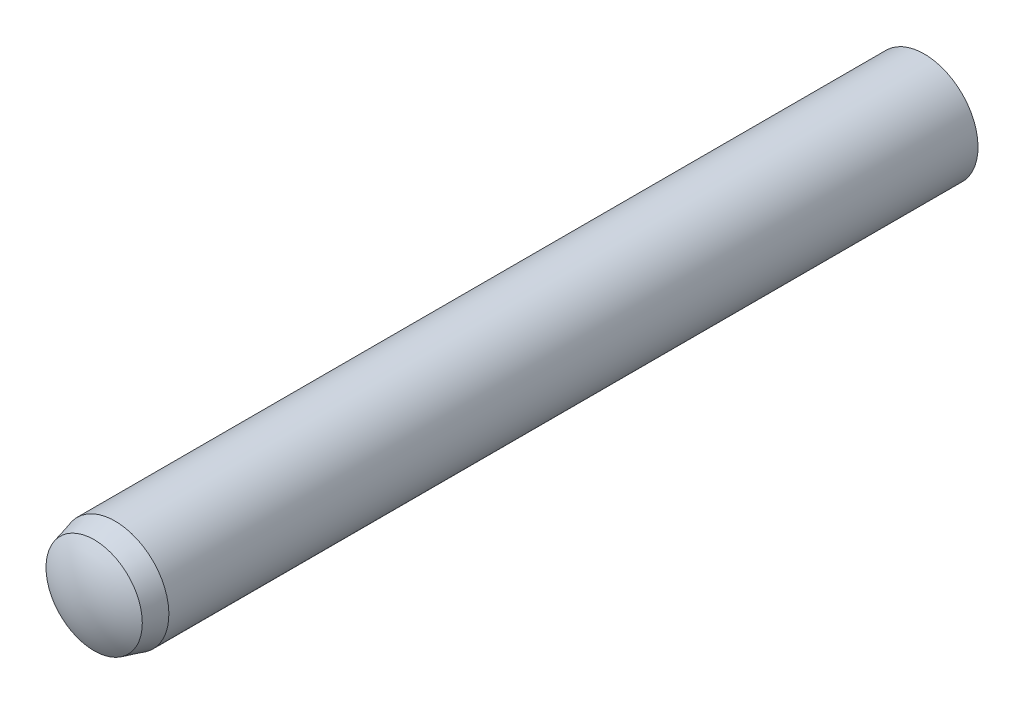
ISO-10303-21;
HEADER;
FILE_DESCRIPTION(('STEP AP214'),'2;1');
FILE_NAME('part.step','',(''),(''),'','','');
FILE_SCHEMA(('AUTOMOTIVE_DESIGN { 1 0 10303 214 1 1 1 1 }'));
ENDSEC;
DATA;
#1=APPLICATION_CONTEXT('core data for automotive mechanical design processes');
#2=APPLICATION_PROTOCOL_DEFINITION('international standard','automotive_design',2000,#1);
#3=PRODUCT_CONTEXT('',#1,'mechanical');
#4=PRODUCT('Part','Part','',(#3));
#5=PRODUCT_RELATED_PRODUCT_CATEGORY('part','',(#4));
#6=PRODUCT_DEFINITION_FORMATION('','',#4);
#7=PRODUCT_DEFINITION_CONTEXT('part definition',#1,'design');
#8=PRODUCT_DEFINITION('design','',#6,#7);
#9=PRODUCT_DEFINITION_SHAPE('','',#8);
#10=(LENGTH_UNIT() NAMED_UNIT(*) SI_UNIT(.MILLI.,.METRE.));
#11=(NAMED_UNIT(*) PLANE_ANGLE_UNIT() SI_UNIT($,.RADIAN.));
#12=(NAMED_UNIT(*) SI_UNIT($,.STERADIAN.) SOLID_ANGLE_UNIT());
#13=UNCERTAINTY_MEASURE_WITH_UNIT(LENGTH_MEASURE(1.E-05),#10,'distance_accuracy_value','');
#14=(GEOMETRIC_REPRESENTATION_CONTEXT(3) GLOBAL_UNCERTAINTY_ASSIGNED_CONTEXT((#13)) GLOBAL_UNIT_ASSIGNED_CONTEXT((#10,
#11,#12)) REPRESENTATION_CONTEXT('',''));
#15=CARTESIAN_POINT('',(0.,0.,0.));
#16=DIRECTION('',(0.,0.,1.));
#17=DIRECTION('',(1.,0.,0.));
#18=AXIS2_PLACEMENT_3D('',#15,#16,#17);
#19=CARTESIAN_POINT('',(0.,0.,-7.72916666666671));
#20=DIRECTION('',(0.,0.,1.));
#21=DIRECTION('',(0.,-1.,0.));
#22=AXIS2_PLACEMENT_3D('',#19,#20,#21);
#23=SPHERICAL_SURFACE('',#22,2.27083333333329);
#24=CARTESIAN_POINT('',(0.,0.,-9.625));
#25=DIRECTION('',(0.,0.,1.));
#26=DIRECTION('',(0.,-1.,0.));
#27=AXIS2_PLACEMENT_3D('',#24,#25,#26);
#28=CIRCLE('',#27,1.24999999999999);
#29=CARTESIAN_POINT('',(0.,-1.24999999999999,-9.625));
#30=VERTEX_POINT('',#29);
#31=EDGE_CURVE('E10',#30,#30,#28,.T.);
#32=ORIENTED_EDGE('',*,*,#31,.F.);
#33=EDGE_LOOP('',(#32));
#34=FACE_BOUND('',#33,.T.);
#35=ADVANCED_FACE('F30',(#34),#23,.T.);
#36=CARTESIAN_POINT('',(0.,0.,10.));
#37=DIRECTION('',(0.,0.,1.));
#38=DIRECTION('',(0.,-1.,0.));
#39=AXIS2_PLACEMENT_3D('',#36,#37,#38);
#40=CYLINDRICAL_SURFACE('',#39,1.25);
#41=CARTESIAN_POINT('',(0.,0.,9.1875));
#42=DIRECTION('',(0.,0.,1.));
#43=DIRECTION('',(0.,-1.,0.));
#44=AXIS2_PLACEMENT_3D('',#41,#42,#43);
#45=CIRCLE('',#44,1.25);
#46=CARTESIAN_POINT('',(0.,-1.25,9.1875));
#47=VERTEX_POINT('',#46);
#48=EDGE_CURVE('E36',#47,#47,#45,.T.);
#49=ORIENTED_EDGE('',*,*,#48,.F.);
#50=EDGE_LOOP('',(#49));
#51=FACE_BOUND('',#50,.T.);
#52=ORIENTED_EDGE('',*,*,#31,.T.);
#53=EDGE_LOOP('',(#52));
#54=FACE_BOUND('',#53,.T.);
#55=ADVANCED_FACE('F51',(#51,#54),#40,.T.);
#56=CARTESIAN_POINT('',(0.,0.,9.1875));
#57=DIRECTION('',(0.,0.,-1.));
#58=DIRECTION('',(0.,1.,0.));
#59=AXIS2_PLACEMENT_3D('',#56,#57,#58);
#60=CONICAL_SURFACE('',#59,1.25,0.261799387799148);
#61=CARTESIAN_POINT('',(0.,0.,9.675));
#62=DIRECTION('',(0.,0.,1.));
#63=DIRECTION('',(0.,-1.,0.));
#64=AXIS2_PLACEMENT_3D('',#61,#62,#63);
#65=CIRCLE('',#64,1.11937476868983);
#66=CARTESIAN_POINT('',(0.,-1.11937476868983,9.675));
#67=VERTEX_POINT('',#66);
#68=EDGE_CURVE('E40',#67,#67,#65,.T.);
#69=ORIENTED_EDGE('',*,*,#68,.F.);
#70=EDGE_LOOP('',(#69));
#71=FACE_BOUND('',#70,.T.);
#72=ORIENTED_EDGE('',*,*,#48,.T.);
#73=EDGE_LOOP('',(#72));
#74=FACE_BOUND('',#73,.T.);
#75=ADVANCED_FACE('F49',(#71,#74),#60,.T.);
#76=CARTESIAN_POINT('',(0.,0.,7.90980788803169));
#77=DIRECTION('',(0.,0.,1.));
#78=DIRECTION('',(0.,1.,0.));
#79=AXIS2_PLACEMENT_3D('',#76,#77,#78);
#80=SPHERICAL_SURFACE('',#79,2.09019211196831);
#81=ORIENTED_EDGE('',*,*,#68,.T.);
#82=EDGE_LOOP('',(#81));
#83=FACE_BOUND('',#82,.T.);
#84=ADVANCED_FACE('F47',(#83),#80,.T.);
#85=CLOSED_SHELL('',(#35,#55,#75,#84));
#86=MANIFOLD_SOLID_BREP('B2',#85);
#87=ADVANCED_BREP_SHAPE_REPRESENTATION('',(#18,#86),#14);
#88=SHAPE_DEFINITION_REPRESENTATION(#9,#87);
ENDSEC;
END-ISO-10303-21;
